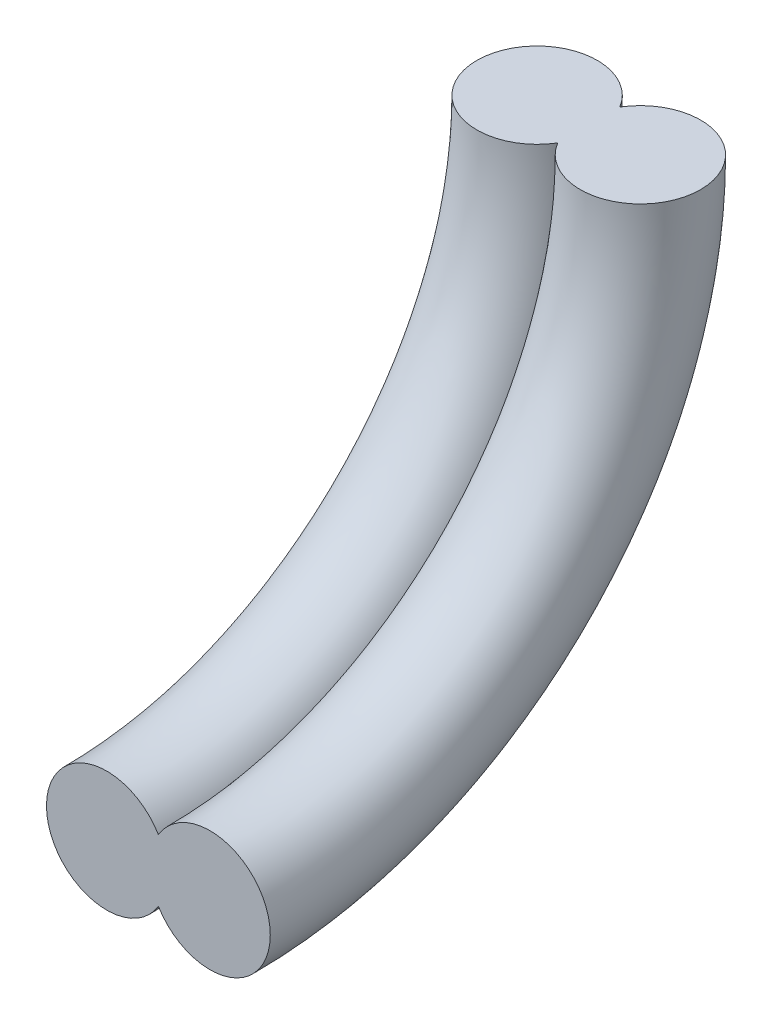
ISO-10303-21;
HEADER;
FILE_DESCRIPTION(('STEP AP214'),'2;1');
FILE_NAME('part.step','',(''),(''),'','','');
FILE_SCHEMA(('AUTOMOTIVE_DESIGN { 1 0 10303 214 1 1 1 1 }'));
ENDSEC;
DATA;
#1=APPLICATION_CONTEXT('core data for automotive mechanical design processes');
#2=APPLICATION_PROTOCOL_DEFINITION('international standard','automotive_design',2000,#1);
#3=PRODUCT_CONTEXT('',#1,'mechanical');
#4=PRODUCT('Part','Part','',(#3));
#5=PRODUCT_RELATED_PRODUCT_CATEGORY('part','',(#4));
#6=PRODUCT_DEFINITION_FORMATION('','',#4);
#7=PRODUCT_DEFINITION_CONTEXT('part definition',#1,'design');
#8=PRODUCT_DEFINITION('design','',#6,#7);
#9=PRODUCT_DEFINITION_SHAPE('','',#8);
#10=(LENGTH_UNIT() NAMED_UNIT(*) SI_UNIT(.MILLI.,.METRE.));
#11=(NAMED_UNIT(*) PLANE_ANGLE_UNIT() SI_UNIT($,.RADIAN.));
#12=(NAMED_UNIT(*) SI_UNIT($,.STERADIAN.) SOLID_ANGLE_UNIT());
#13=UNCERTAINTY_MEASURE_WITH_UNIT(LENGTH_MEASURE(1.E-05),#10,'distance_accuracy_value','');
#14=(GEOMETRIC_REPRESENTATION_CONTEXT(3) GLOBAL_UNCERTAINTY_ASSIGNED_CONTEXT((#13)) GLOBAL_UNIT_ASSIGNED_CONTEXT((#10,
#11,#12)) REPRESENTATION_CONTEXT('',''));
#15=CARTESIAN_POINT('',(0.,0.,0.));
#16=DIRECTION('',(0.,0.,1.));
#17=DIRECTION('',(1.,0.,0.));
#18=AXIS2_PLACEMENT_3D('',#15,#16,#17);
#19=CARTESIAN_POINT('',(0.762,0.,6.35));
#20=DIRECTION('',(-1.,0.,0.));
#21=DIRECTION('',(0.,0.,1.));
#22=AXIS2_PLACEMENT_3D('',#19,#20,#21);
#23=TOROIDAL_SURFACE('',#22,6.35,0.889);
#24=CARTESIAN_POINT('',(0.,0.,6.35));
#25=DIRECTION('',(1.,0.,0.));
#26=DIRECTION('',(0.,0.,-1.));
#27=AXIS2_PLACEMENT_3D('',#24,#25,#26);
#28=CIRCLE('',#27,5.89209498801607);
#29=CARTESIAN_POINT('',(0.,-5.89209498801607,6.35));
#30=VERTEX_POINT('',#29);
#31=CARTESIAN_POINT('',(0.,0.,0.457905011983929));
#32=VERTEX_POINT('',#31);
#33=EDGE_CURVE('E11',#30,#32,#28,.T.);
#34=ORIENTED_EDGE('',*,*,#33,.F.);
#35=CARTESIAN_POINT('',(0.762,-6.35,6.35));
#36=DIRECTION('',(0.,0.,-1.));
#37=DIRECTION('',(0.,1.,0.));
#38=AXIS2_PLACEMENT_3D('',#35,#36,#37);
#39=CIRCLE('',#38,0.889);
#40=CARTESIAN_POINT('',(0.,-6.80790501198393,6.35));
#41=VERTEX_POINT('',#40);
#42=EDGE_CURVE('E60',#30,#41,#39,.T.);
#43=ORIENTED_EDGE('',*,*,#42,.T.);
#44=CARTESIAN_POINT('',(0.,0.,6.35));
#45=DIRECTION('',(-1.,0.,0.));
#46=DIRECTION('',(0.,0.,1.));
#47=AXIS2_PLACEMENT_3D('',#44,#45,#46);
#48=CIRCLE('',#47,6.80790501198393);
#49=CARTESIAN_POINT('',(0.,0.,-0.457905011983929));
#50=VERTEX_POINT('',#49);
#51=EDGE_CURVE('E45',#50,#41,#48,.T.);
#52=ORIENTED_EDGE('',*,*,#51,.F.);
#53=CARTESIAN_POINT('',(0.762,0.,0.));
#54=DIRECTION('',(0.,1.,0.));
#55=DIRECTION('',(0.,0.,1.));
#56=AXIS2_PLACEMENT_3D('',#53,#54,#55);
#57=CIRCLE('',#56,0.889);
#58=EDGE_CURVE('E52',#32,#50,#57,.T.);
#59=ORIENTED_EDGE('',*,*,#58,.F.);
#60=EDGE_LOOP('',(#34,#43,#52,#59));
#61=FACE_BOUND('',#60,.T.);
#62=ADVANCED_FACE('F37',(#61),#23,.T.);
#63=CARTESIAN_POINT('',(0.762,0.,0.));
#64=DIRECTION('',(0.,1.,0.));
#65=DIRECTION('',(0.,0.,1.));
#66=AXIS2_PLACEMENT_3D('',#63,#64,#65);
#67=PLANE('',#66);
#68=ORIENTED_EDGE('',*,*,#58,.T.);
#69=CARTESIAN_POINT('',(-0.762,0.,0.));
#70=DIRECTION('',(0.,-1.,0.));
#71=DIRECTION('',(0.,0.,1.));
#72=AXIS2_PLACEMENT_3D('',#69,#70,#71);
#73=CIRCLE('',#72,0.889);
#74=EDGE_CURVE('E70',#50,#32,#73,.F.);
#75=ORIENTED_EDGE('',*,*,#74,.T.);
#76=EDGE_LOOP('',(#68,#75));
#77=FACE_BOUND('',#76,.T.);
#78=ADVANCED_FACE('F39',(#77),#67,.T.);
#79=CARTESIAN_POINT('',(0.762,-6.35,6.35));
#80=DIRECTION('',(0.,0.,-1.));
#81=DIRECTION('',(0.,1.,0.));
#82=AXIS2_PLACEMENT_3D('',#79,#80,#81);
#83=PLANE('',#82);
#84=ORIENTED_EDGE('',*,*,#42,.F.);
#85=CARTESIAN_POINT('',(-0.762,-6.35,6.35));
#86=DIRECTION('',(0.,0.,1.));
#87=DIRECTION('',(0.,1.,0.));
#88=AXIS2_PLACEMENT_3D('',#85,#86,#87);
#89=CIRCLE('',#88,0.889);
#90=EDGE_CURVE('E68',#41,#30,#89,.F.);
#91=ORIENTED_EDGE('',*,*,#90,.F.);
#92=EDGE_LOOP('',(#84,#91));
#93=FACE_BOUND('',#92,.T.);
#94=ADVANCED_FACE('F71',(#93),#83,.F.);
#95=CARTESIAN_POINT('',(-0.762,0.,6.35));
#96=DIRECTION('',(-1.,0.,0.));
#97=DIRECTION('',(0.,0.,1.));
#98=AXIS2_PLACEMENT_3D('',#95,#96,#97);
#99=TOROIDAL_SURFACE('',#98,6.35,0.889);
#100=ORIENTED_EDGE('',*,*,#90,.T.);
#101=ORIENTED_EDGE('',*,*,#33,.T.);
#102=ORIENTED_EDGE('',*,*,#74,.F.);
#103=ORIENTED_EDGE('',*,*,#51,.T.);
#104=EDGE_LOOP('',(#100,#101,#102,#103));
#105=FACE_BOUND('',#104,.T.);
#106=ADVANCED_FACE('F67',(#105),#99,.T.);
#107=CLOSED_SHELL('',(#62,#78,#94,#106));
#108=MANIFOLD_SOLID_BREP('B2',#107);
#109=ADVANCED_BREP_SHAPE_REPRESENTATION('',(#18,#108),#14);
#110=SHAPE_DEFINITION_REPRESENTATION(#9,#109);
ENDSEC;
END-ISO-10303-21;
